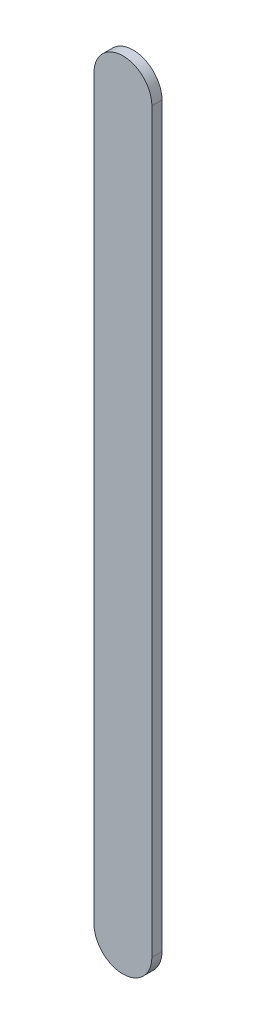
ISO-10303-21;
HEADER;
FILE_DESCRIPTION(('STEP AP214'),'2;1');
FILE_NAME('part.step','',(''),(''),'','','');
FILE_SCHEMA(('AUTOMOTIVE_DESIGN { 1 0 10303 214 1 1 1 1 }'));
ENDSEC;
DATA;
#1=APPLICATION_CONTEXT('core data for automotive mechanical design processes');
#2=APPLICATION_PROTOCOL_DEFINITION('international standard','automotive_design',2000,#1);
#3=PRODUCT_CONTEXT('',#1,'mechanical');
#4=PRODUCT('Part','Part','',(#3));
#5=PRODUCT_RELATED_PRODUCT_CATEGORY('part','',(#4));
#6=PRODUCT_DEFINITION_FORMATION('','',#4);
#7=PRODUCT_DEFINITION_CONTEXT('part definition',#1,'design');
#8=PRODUCT_DEFINITION('design','',#6,#7);
#9=PRODUCT_DEFINITION_SHAPE('','',#8);
#10=(LENGTH_UNIT() NAMED_UNIT(*) SI_UNIT(.MILLI.,.METRE.));
#11=(NAMED_UNIT(*) PLANE_ANGLE_UNIT() SI_UNIT($,.RADIAN.));
#12=(NAMED_UNIT(*) SI_UNIT($,.STERADIAN.) SOLID_ANGLE_UNIT());
#13=UNCERTAINTY_MEASURE_WITH_UNIT(LENGTH_MEASURE(1.E-05),#10,'distance_accuracy_value','');
#14=(GEOMETRIC_REPRESENTATION_CONTEXT(3) GLOBAL_UNCERTAINTY_ASSIGNED_CONTEXT((#13)) GLOBAL_UNIT_ASSIGNED_CONTEXT((#10,
#11,#12)) REPRESENTATION_CONTEXT('',''));
#15=CARTESIAN_POINT('',(0.,0.,0.));
#16=DIRECTION('',(0.,0.,1.));
#17=DIRECTION('',(1.,0.,0.));
#18=AXIS2_PLACEMENT_3D('',#15,#16,#17);
#19=CARTESIAN_POINT('',(93.3,-115.9,1.635));
#20=DIRECTION('',(0.,0.,1.));
#21=DIRECTION('',(1.,0.,0.));
#22=AXIS2_PLACEMENT_3D('',#19,#20,#21);
#23=PLANE('',#22);
#24=DIRECTION('',(0.,1.,0.));
#25=VECTOR('',#24,1.);
#26=CARTESIAN_POINT('',(93.3,-115.9,1.635));
#27=LINE('',#26,#25);
#28=CARTESIAN_POINT('',(93.3,-115.9,1.635));
#29=VERTEX_POINT('',#28);
#30=CARTESIAN_POINT('',(93.3,-113.35,1.635));
#31=VERTEX_POINT('',#30);
#32=EDGE_CURVE('E93',#29,#31,#27,.T.);
#33=ORIENTED_EDGE('',*,*,#32,.T.);
#34=CARTESIAN_POINT('',(93.2,-113.35,1.635));
#35=DIRECTION('',(0.,0.,1.));
#36=DIRECTION('',(1.,0.,0.));
#37=AXIS2_PLACEMENT_3D('',#34,#35,#36);
#38=CIRCLE('',#37,0.1);
#39=CARTESIAN_POINT('',(93.1,-113.35,1.635));
#40=VERTEX_POINT('',#39);
#41=EDGE_CURVE('E73',#31,#40,#38,.T.);
#42=ORIENTED_EDGE('',*,*,#41,.T.);
#43=DIRECTION('',(0.,-1.,0.));
#44=VECTOR('',#43,1.);
#45=CARTESIAN_POINT('',(93.1,-113.35,1.635));
#46=LINE('',#45,#44);
#47=CARTESIAN_POINT('',(93.1,-115.9,1.635));
#48=VERTEX_POINT('',#47);
#49=EDGE_CURVE('E87',#40,#48,#46,.T.);
#50=ORIENTED_EDGE('',*,*,#49,.T.);
#51=CARTESIAN_POINT('',(93.2,-115.9,1.635));
#52=DIRECTION('',(0.,0.,1.));
#53=DIRECTION('',(-1.,0.,0.));
#54=AXIS2_PLACEMENT_3D('',#51,#52,#53);
#55=CIRCLE('',#54,0.1);
#56=EDGE_CURVE('E11',#48,#29,#55,.T.);
#57=ORIENTED_EDGE('',*,*,#56,.T.);
#58=EDGE_LOOP('',(#33,#42,#50,#57));
#59=FACE_BOUND('',#58,.T.);
#60=ADVANCED_FACE('F17',(#59),#23,.T.);
#61=CARTESIAN_POINT('',(93.3,-115.9,1.6));
#62=DIRECTION('',(0.,0.,1.));
#63=DIRECTION('',(1.,0.,0.));
#64=AXIS2_PLACEMENT_3D('',#61,#62,#63);
#65=PLANE('',#64);
#66=CARTESIAN_POINT('',(93.2,-115.9,1.6));
#67=DIRECTION('',(0.,0.,1.));
#68=DIRECTION('',(-1.,0.,0.));
#69=AXIS2_PLACEMENT_3D('',#66,#67,#68);
#70=CIRCLE('',#69,0.1);
#71=CARTESIAN_POINT('',(93.1,-115.9,1.6));
#72=VERTEX_POINT('',#71);
#73=CARTESIAN_POINT('',(93.3,-115.9,1.6));
#74=VERTEX_POINT('',#73);
#75=EDGE_CURVE('E20',#72,#74,#70,.T.);
#76=ORIENTED_EDGE('',*,*,#75,.F.);
#77=DIRECTION('',(0.,-1.,0.));
#78=VECTOR('',#77,1.);
#79=CARTESIAN_POINT('',(93.1,-113.35,1.6));
#80=LINE('',#79,#78);
#81=CARTESIAN_POINT('',(93.1,-113.35,1.6));
#82=VERTEX_POINT('',#81);
#83=EDGE_CURVE('E58',#82,#72,#80,.T.);
#84=ORIENTED_EDGE('',*,*,#83,.F.);
#85=CARTESIAN_POINT('',(93.2,-113.35,1.6));
#86=DIRECTION('',(0.,0.,1.));
#87=DIRECTION('',(1.,0.,0.));
#88=AXIS2_PLACEMENT_3D('',#85,#86,#87);
#89=CIRCLE('',#88,0.1);
#90=CARTESIAN_POINT('',(93.3,-113.35,1.6));
#91=VERTEX_POINT('',#90);
#92=EDGE_CURVE('E95',#91,#82,#89,.T.);
#93=ORIENTED_EDGE('',*,*,#92,.F.);
#94=DIRECTION('',(0.,1.,0.));
#95=VECTOR('',#94,1.);
#96=CARTESIAN_POINT('',(93.3,-115.9,1.6));
#97=LINE('',#96,#95);
#98=EDGE_CURVE('E92',#74,#91,#97,.T.);
#99=ORIENTED_EDGE('',*,*,#98,.F.);
#100=EDGE_LOOP('',(#76,#84,#93,#99));
#101=FACE_BOUND('',#100,.T.);
#102=ADVANCED_FACE('F97',(#101),#65,.F.);
#103=CARTESIAN_POINT('',(93.2,-115.9,1.6));
#104=DIRECTION('',(0.,0.,-1.));
#105=DIRECTION('',(-1.,0.,0.));
#106=AXIS2_PLACEMENT_3D('',#103,#104,#105);
#107=CYLINDRICAL_SURFACE('',#106,0.1);
#108=ORIENTED_EDGE('',*,*,#75,.T.);
#109=DIRECTION('',(0.,0.,1.));
#110=VECTOR('',#109,1.);
#111=CARTESIAN_POINT('',(93.3,-115.9,1.6));
#112=LINE('',#111,#110);
#113=EDGE_CURVE('E82',#74,#29,#112,.T.);
#114=ORIENTED_EDGE('',*,*,#113,.T.);
#115=ORIENTED_EDGE('',*,*,#56,.F.);
#116=DIRECTION('',(0.,0.,1.));
#117=VECTOR('',#116,1.);
#118=CARTESIAN_POINT('',(93.1,-115.9,1.6));
#119=LINE('',#118,#117);
#120=EDGE_CURVE('E85',#72,#48,#119,.T.);
#121=ORIENTED_EDGE('',*,*,#120,.F.);
#122=EDGE_LOOP('',(#108,#114,#115,#121));
#123=FACE_BOUND('',#122,.T.);
#124=ADVANCED_FACE('F81',(#123),#107,.T.);
#125=CARTESIAN_POINT('',(93.1,-113.35,1.6));
#126=DIRECTION('',(1.,0.,0.));
#127=DIRECTION('',(0.,1.,0.));
#128=AXIS2_PLACEMENT_3D('',#125,#126,#127);
#129=PLANE('',#128);
#130=ORIENTED_EDGE('',*,*,#83,.T.);
#131=ORIENTED_EDGE('',*,*,#120,.T.);
#132=ORIENTED_EDGE('',*,*,#49,.F.);
#133=DIRECTION('',(0.,0.,1.));
#134=VECTOR('',#133,1.);
#135=CARTESIAN_POINT('',(93.1,-113.35,1.6));
#136=LINE('',#135,#134);
#137=EDGE_CURVE('E111',#82,#40,#136,.T.);
#138=ORIENTED_EDGE('',*,*,#137,.F.);
#139=EDGE_LOOP('',(#130,#131,#132,#138));
#140=FACE_BOUND('',#139,.T.);
#141=ADVANCED_FACE('F124',(#140),#129,.F.);
#142=CARTESIAN_POINT('',(93.2,-113.35,1.6));
#143=DIRECTION('',(0.,0.,-1.));
#144=DIRECTION('',(1.,0.,0.));
#145=AXIS2_PLACEMENT_3D('',#142,#143,#144);
#146=CYLINDRICAL_SURFACE('',#145,0.1);
#147=ORIENTED_EDGE('',*,*,#92,.T.);
#148=ORIENTED_EDGE('',*,*,#137,.T.);
#149=ORIENTED_EDGE('',*,*,#41,.F.);
#150=DIRECTION('',(0.,0.,1.));
#151=VECTOR('',#150,1.);
#152=CARTESIAN_POINT('',(93.3,-113.35,1.6));
#153=LINE('',#152,#151);
#154=EDGE_CURVE('E100',#91,#31,#153,.T.);
#155=ORIENTED_EDGE('',*,*,#154,.F.);
#156=EDGE_LOOP('',(#147,#148,#149,#155));
#157=FACE_BOUND('',#156,.T.);
#158=ADVANCED_FACE('F125',(#157),#146,.T.);
#159=CARTESIAN_POINT('',(93.3,-115.9,1.6));
#160=DIRECTION('',(-1.,0.,0.));
#161=DIRECTION('',(0.,0.,1.));
#162=AXIS2_PLACEMENT_3D('',#159,#160,#161);
#163=PLANE('',#162);
#164=ORIENTED_EDGE('',*,*,#98,.T.);
#165=ORIENTED_EDGE('',*,*,#154,.T.);
#166=ORIENTED_EDGE('',*,*,#32,.F.);
#167=ORIENTED_EDGE('',*,*,#113,.F.);
#168=EDGE_LOOP('',(#164,#165,#166,#167));
#169=FACE_BOUND('',#168,.T.);
#170=ADVANCED_FACE('F90',(#169),#163,.F.);
#171=CLOSED_SHELL('',(#60,#102,#124,#141,#158,#170));
#172=MANIFOLD_SOLID_BREP('B1',#171);
#173=ADVANCED_BREP_SHAPE_REPRESENTATION('',(#18,#172),#14);
#174=SHAPE_DEFINITION_REPRESENTATION(#9,#173);
ENDSEC;
END-ISO-10303-21;
